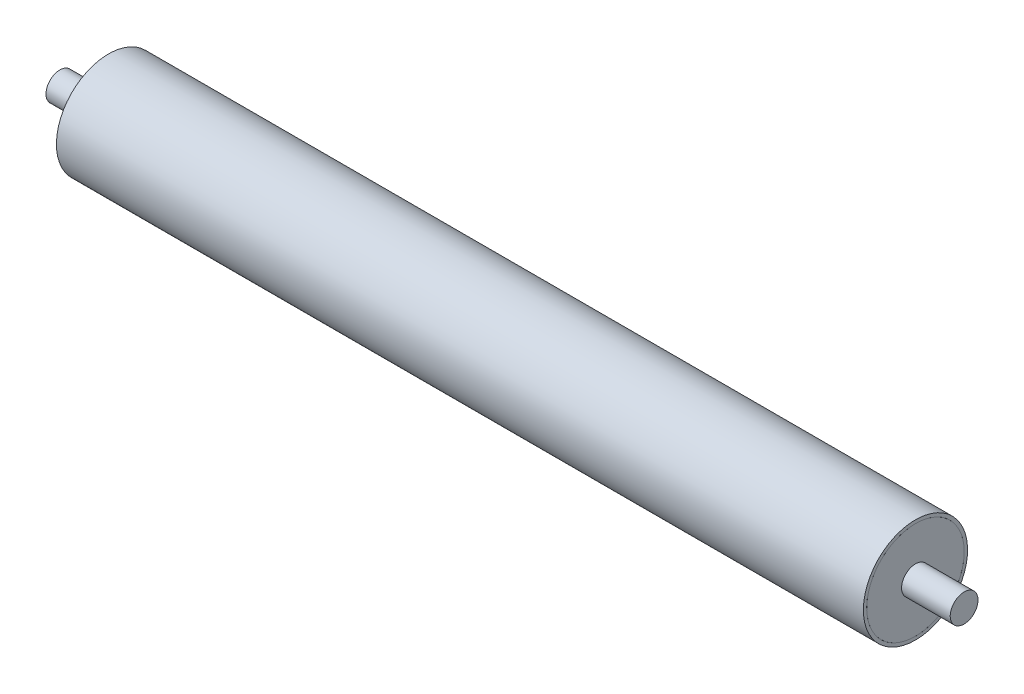
ISO-10303-21;
HEADER;
FILE_DESCRIPTION(('STEP AP214'),'2;1');
FILE_NAME('part.step','',(''),(''),'','','');
FILE_SCHEMA(('AUTOMOTIVE_DESIGN { 1 0 10303 214 1 1 1 1 }'));
ENDSEC;
DATA;
#1=APPLICATION_CONTEXT('core data for automotive mechanical design processes');
#2=APPLICATION_PROTOCOL_DEFINITION('international standard','automotive_design',2000,#1);
#3=PRODUCT_CONTEXT('',#1,'mechanical');
#4=PRODUCT('Part','Part','',(#3));
#5=PRODUCT_RELATED_PRODUCT_CATEGORY('part','',(#4));
#6=PRODUCT_DEFINITION_FORMATION('','',#4);
#7=PRODUCT_DEFINITION_CONTEXT('part definition',#1,'design');
#8=PRODUCT_DEFINITION('design','',#6,#7);
#9=PRODUCT_DEFINITION_SHAPE('','',#8);
#10=(LENGTH_UNIT() NAMED_UNIT(*) SI_UNIT(.MILLI.,.METRE.));
#11=(NAMED_UNIT(*) PLANE_ANGLE_UNIT() SI_UNIT($,.RADIAN.));
#12=(NAMED_UNIT(*) SI_UNIT($,.STERADIAN.) SOLID_ANGLE_UNIT());
#13=UNCERTAINTY_MEASURE_WITH_UNIT(LENGTH_MEASURE(1.E-05),#10,'distance_accuracy_value','');
#14=(GEOMETRIC_REPRESENTATION_CONTEXT(3) GLOBAL_UNCERTAINTY_ASSIGNED_CONTEXT((#13)) GLOBAL_UNIT_ASSIGNED_CONTEXT((#10,
#11,#12)) REPRESENTATION_CONTEXT('',''));
#15=CARTESIAN_POINT('',(0.,0.,0.));
#16=DIRECTION('',(0.,0.,1.));
#17=DIRECTION('',(1.,0.,0.));
#18=AXIS2_PLACEMENT_3D('',#15,#16,#17);
#19=CARTESIAN_POINT('',(-325.3,9.99999999999994,0.));
#20=DIRECTION('',(1.,0.,0.));
#21=DIRECTION('',(0.,1.,0.));
#22=AXIS2_PLACEMENT_3D('',#19,#20,#21);
#23=PLANE('',#22);
#24=CARTESIAN_POINT('',(-325.3,0.,0.));
#25=DIRECTION('',(-1.,0.,0.));
#26=DIRECTION('',(0.,-1.,0.));
#27=AXIS2_PLACEMENT_3D('',#24,#25,#26);
#28=CIRCLE('',#27,10.);
#29=CARTESIAN_POINT('',(-325.3,-10.0000000000001,0.));
#30=VERTEX_POINT('',#29);
#31=EDGE_CURVE('E47',#30,#30,#28,.T.);
#32=ORIENTED_EDGE('',*,*,#31,.T.);
#33=EDGE_LOOP('',(#32));
#34=FACE_BOUND('',#33,.T.);
#35=ADVANCED_FACE('F41',(#34),#23,.F.);
#36=CARTESIAN_POINT('',(325.3,10.0000000000002,0.));
#37=DIRECTION('',(-1.,0.,0.));
#38=DIRECTION('',(0.,-1.,0.));
#39=AXIS2_PLACEMENT_3D('',#36,#37,#38);
#40=PLANE('',#39);
#41=CARTESIAN_POINT('',(325.3,0.,0.));
#42=DIRECTION('',(-1.,0.,0.));
#43=DIRECTION('',(0.,-1.,0.));
#44=AXIS2_PLACEMENT_3D('',#41,#42,#43);
#45=CIRCLE('',#44,10.0000000000001);
#46=CARTESIAN_POINT('',(325.3,-10.,0.));
#47=VERTEX_POINT('',#46);
#48=EDGE_CURVE('E11',#47,#47,#45,.T.);
#49=ORIENTED_EDGE('',*,*,#48,.F.);
#50=EDGE_LOOP('',(#49));
#51=FACE_BOUND('',#50,.T.);
#52=ADVANCED_FACE('F56',(#51),#40,.F.);
#53=CARTESIAN_POINT('',(-325.3,0.,0.));
#54=DIRECTION('',(-1.,0.,0.));
#55=DIRECTION('',(0.,-1.,0.));
#56=AXIS2_PLACEMENT_3D('',#53,#54,#55);
#57=CYLINDRICAL_SURFACE('',#56,10.0000000000001);
#58=ORIENTED_EDGE('',*,*,#31,.F.);
#59=EDGE_LOOP('',(#58));
#60=FACE_BOUND('',#59,.T.);
#61=ORIENTED_EDGE('',*,*,#48,.T.);
#62=EDGE_LOOP('',(#61));
#63=FACE_BOUND('',#62,.T.);
#64=ADVANCED_FACE('F54',(#60,#63),#57,.T.);
#65=CLOSED_SHELL('',(#35,#52,#64));
#66=MANIFOLD_SOLID_BREP('B2',#65);
#67=CARTESIAN_POINT('',(280.3,0.,0.));
#68=DIRECTION('',(1.,0.,0.));
#69=DIRECTION('',(0.,1.,0.));
#70=AXIS2_PLACEMENT_3D('',#67,#68,#69);
#71=CYLINDRICAL_SURFACE('',#70,35.1);
#72=CARTESIAN_POINT('',(280.3,0.,0.));
#73=DIRECTION('',(1.,0.,0.));
#74=DIRECTION('',(0.,1.,0.));
#75=AXIS2_PLACEMENT_3D('',#72,#73,#74);
#76=CIRCLE('',#75,35.1);
#77=CARTESIAN_POINT('',(280.3,35.1000000000001,0.));
#78=VERTEX_POINT('',#77);
#79=EDGE_CURVE('E40',#78,#78,#76,.T.);
#80=ORIENTED_EDGE('',*,*,#79,.T.);
#81=EDGE_LOOP('',(#80));
#82=FACE_BOUND('',#81,.T.);
#83=CARTESIAN_POINT('',(290.3,0.,0.));
#84=DIRECTION('',(1.,0.,0.));
#85=DIRECTION('',(0.,1.,0.));
#86=AXIS2_PLACEMENT_3D('',#83,#84,#85);
#87=CIRCLE('',#86,35.1);
#88=CARTESIAN_POINT('',(290.3,35.1000000000001,0.));
#89=VERTEX_POINT('',#88);
#90=EDGE_CURVE('E92',#89,#89,#87,.T.);
#91=ORIENTED_EDGE('',*,*,#90,.F.);
#92=EDGE_LOOP('',(#91));
#93=FACE_BOUND('',#92,.T.);
#94=ADVANCED_FACE('F89',(#82,#93),#71,.T.);
#95=CARTESIAN_POINT('',(280.3,0.,0.));
#96=DIRECTION('',(1.,0.,0.));
#97=DIRECTION('',(0.,1.,0.));
#98=AXIS2_PLACEMENT_3D('',#95,#96,#97);
#99=PLANE('',#98);
#100=CARTESIAN_POINT('',(280.3,0.,0.));
#101=DIRECTION('',(1.,0.,0.));
#102=DIRECTION('',(0.,1.,0.));
#103=AXIS2_PLACEMENT_3D('',#100,#101,#102);
#104=CIRCLE('',#103,10.0005);
#105=CARTESIAN_POINT('',(280.3,10.0005000000001,0.));
#106=VERTEX_POINT('',#105);
#107=EDGE_CURVE('E99',#106,#106,#104,.T.);
#108=ORIENTED_EDGE('',*,*,#107,.T.);
#109=EDGE_LOOP('',(#108));
#110=FACE_BOUND('',#109,.T.);
#111=ORIENTED_EDGE('',*,*,#79,.F.);
#112=EDGE_LOOP('',(#111));
#113=FACE_BOUND('',#112,.T.);
#114=ADVANCED_FACE('F107',(#110,#113),#99,.F.);
#115=CARTESIAN_POINT('',(290.3,0.,0.));
#116=DIRECTION('',(1.,0.,0.));
#117=DIRECTION('',(0.,1.,0.));
#118=AXIS2_PLACEMENT_3D('',#115,#116,#117);
#119=PLANE('',#118);
#120=CARTESIAN_POINT('',(290.3,0.,0.));
#121=DIRECTION('',(1.,0.,0.));
#122=DIRECTION('',(0.,1.,0.));
#123=AXIS2_PLACEMENT_3D('',#120,#121,#122);
#124=CIRCLE('',#123,10.0005);
#125=CARTESIAN_POINT('',(290.3,10.0005000000001,0.));
#126=VERTEX_POINT('',#125);
#127=EDGE_CURVE('E101',#126,#126,#124,.T.);
#128=ORIENTED_EDGE('',*,*,#127,.F.);
#129=EDGE_LOOP('',(#128));
#130=FACE_BOUND('',#129,.T.);
#131=ORIENTED_EDGE('',*,*,#90,.T.);
#132=EDGE_LOOP('',(#131));
#133=FACE_BOUND('',#132,.T.);
#134=ADVANCED_FACE('F113',(#130,#133),#119,.T.);
#135=CARTESIAN_POINT('',(280.3,0.,0.));
#136=DIRECTION('',(1.,0.,0.));
#137=DIRECTION('',(0.,1.,0.));
#138=AXIS2_PLACEMENT_3D('',#135,#136,#137);
#139=CYLINDRICAL_SURFACE('',#138,10.0005);
#140=ORIENTED_EDGE('',*,*,#107,.F.);
#141=EDGE_LOOP('',(#140));
#142=FACE_BOUND('',#141,.T.);
#143=ORIENTED_EDGE('',*,*,#127,.T.);
#144=EDGE_LOOP('',(#143));
#145=FACE_BOUND('',#144,.T.);
#146=ADVANCED_FACE('F110',(#142,#145),#139,.F.);
#147=CLOSED_SHELL('',(#94,#114,#134,#146));
#148=MANIFOLD_SOLID_BREP('B6',#147);
#149=CARTESIAN_POINT('',(-280.3,0.,0.));
#150=DIRECTION('',(-1.,0.,0.));
#151=DIRECTION('',(0.,-1.,0.));
#152=AXIS2_PLACEMENT_3D('',#149,#150,#151);
#153=CYLINDRICAL_SURFACE('',#152,35.1);
#154=CARTESIAN_POINT('',(-280.3,0.,0.));
#155=DIRECTION('',(-1.,0.,0.));
#156=DIRECTION('',(0.,-1.,0.));
#157=AXIS2_PLACEMENT_3D('',#154,#155,#156);
#158=CIRCLE('',#157,35.1);
#159=CARTESIAN_POINT('',(-280.3,-35.1,0.));
#160=VERTEX_POINT('',#159);
#161=EDGE_CURVE('E88',#160,#160,#158,.T.);
#162=ORIENTED_EDGE('',*,*,#161,.T.);
#163=EDGE_LOOP('',(#162));
#164=FACE_BOUND('',#163,.T.);
#165=CARTESIAN_POINT('',(-290.3,0.,0.));
#166=DIRECTION('',(-1.,0.,0.));
#167=DIRECTION('',(0.,-1.,0.));
#168=AXIS2_PLACEMENT_3D('',#165,#166,#167);
#169=CIRCLE('',#168,35.1);
#170=CARTESIAN_POINT('',(-290.3,-35.1,0.));
#171=VERTEX_POINT('',#170);
#172=EDGE_CURVE('E160',#171,#171,#169,.T.);
#173=ORIENTED_EDGE('',*,*,#172,.F.);
#174=EDGE_LOOP('',(#173));
#175=FACE_BOUND('',#174,.T.);
#176=ADVANCED_FACE('F157',(#164,#175),#153,.T.);
#177=CARTESIAN_POINT('',(-280.3,0.,0.));
#178=DIRECTION('',(-1.,0.,0.));
#179=DIRECTION('',(0.,-1.,0.));
#180=AXIS2_PLACEMENT_3D('',#177,#178,#179);
#181=PLANE('',#180);
#182=CARTESIAN_POINT('',(-280.3,0.,0.));
#183=DIRECTION('',(-1.,0.,0.));
#184=DIRECTION('',(0.,-1.,0.));
#185=AXIS2_PLACEMENT_3D('',#182,#183,#184);
#186=CIRCLE('',#185,10.0005);
#187=CARTESIAN_POINT('',(-280.3,-10.0005,0.));
#188=VERTEX_POINT('',#187);
#189=EDGE_CURVE('E167',#188,#188,#186,.T.);
#190=ORIENTED_EDGE('',*,*,#189,.T.);
#191=EDGE_LOOP('',(#190));
#192=FACE_BOUND('',#191,.T.);
#193=ORIENTED_EDGE('',*,*,#161,.F.);
#194=EDGE_LOOP('',(#193));
#195=FACE_BOUND('',#194,.T.);
#196=ADVANCED_FACE('F175',(#192,#195),#181,.F.);
#197=CARTESIAN_POINT('',(-290.3,0.,0.));
#198=DIRECTION('',(-1.,0.,0.));
#199=DIRECTION('',(0.,-1.,0.));
#200=AXIS2_PLACEMENT_3D('',#197,#198,#199);
#201=PLANE('',#200);
#202=CARTESIAN_POINT('',(-290.3,0.,0.));
#203=DIRECTION('',(-1.,0.,0.));
#204=DIRECTION('',(0.,-1.,0.));
#205=AXIS2_PLACEMENT_3D('',#202,#203,#204);
#206=CIRCLE('',#205,10.0005);
#207=CARTESIAN_POINT('',(-290.3,-10.0005,0.));
#208=VERTEX_POINT('',#207);
#209=EDGE_CURVE('E169',#208,#208,#206,.T.);
#210=ORIENTED_EDGE('',*,*,#209,.F.);
#211=EDGE_LOOP('',(#210));
#212=FACE_BOUND('',#211,.T.);
#213=ORIENTED_EDGE('',*,*,#172,.T.);
#214=EDGE_LOOP('',(#213));
#215=FACE_BOUND('',#214,.T.);
#216=ADVANCED_FACE('F181',(#212,#215),#201,.T.);
#217=CARTESIAN_POINT('',(-280.3,0.,0.));
#218=DIRECTION('',(-1.,0.,0.));
#219=DIRECTION('',(0.,-1.,0.));
#220=AXIS2_PLACEMENT_3D('',#217,#218,#219);
#221=CYLINDRICAL_SURFACE('',#220,10.0005);
#222=ORIENTED_EDGE('',*,*,#189,.F.);
#223=EDGE_LOOP('',(#222));
#224=FACE_BOUND('',#223,.T.);
#225=ORIENTED_EDGE('',*,*,#209,.T.);
#226=EDGE_LOOP('',(#225));
#227=FACE_BOUND('',#226,.T.);
#228=ADVANCED_FACE('F178',(#224,#227),#221,.F.);
#229=CLOSED_SHELL('',(#176,#196,#216,#228));
#230=MANIFOLD_SOLID_BREP('B35',#229);
#231=CARTESIAN_POINT('',(-290.3,35.1004999999999,0.));
#232=DIRECTION('',(1.,0.,0.));
#233=DIRECTION('',(0.,1.,0.));
#234=AXIS2_PLACEMENT_3D('',#231,#232,#233);
#235=PLANE('',#234);
#236=CARTESIAN_POINT('',(-290.3,0.,0.));
#237=DIRECTION('',(-1.,0.,0.));
#238=DIRECTION('',(0.,-1.,0.));
#239=AXIS2_PLACEMENT_3D('',#236,#237,#238);
#240=CIRCLE('',#239,35.1004999999999);
#241=CARTESIAN_POINT('',(-290.3,-35.1004999999999,0.));
#242=VERTEX_POINT('',#241);
#243=EDGE_CURVE('E232',#242,#242,#240,.T.);
#244=ORIENTED_EDGE('',*,*,#243,.F.);
#245=EDGE_LOOP('',(#244));
#246=FACE_BOUND('',#245,.T.);
#247=CARTESIAN_POINT('',(-290.3,0.,0.));
#248=DIRECTION('',(-1.,0.,0.));
#249=DIRECTION('',(0.,-1.,0.));
#250=AXIS2_PLACEMENT_3D('',#247,#248,#249);
#251=CIRCLE('',#250,37.5);
#252=CARTESIAN_POINT('',(-290.3,-37.5,0.));
#253=VERTEX_POINT('',#252);
#254=EDGE_CURVE('E156',#253,#253,#251,.T.);
#255=ORIENTED_EDGE('',*,*,#254,.T.);
#256=EDGE_LOOP('',(#255));
#257=FACE_BOUND('',#256,.T.);
#258=ADVANCED_FACE('F218',(#246,#257),#235,.F.);
#259=CARTESIAN_POINT('',(-290.3,0.,0.));
#260=DIRECTION('',(-1.,0.,0.));
#261=DIRECTION('',(0.,-1.,0.));
#262=AXIS2_PLACEMENT_3D('',#259,#260,#261);
#263=CYLINDRICAL_SURFACE('',#262,37.5);
#264=ORIENTED_EDGE('',*,*,#254,.F.);
#265=EDGE_LOOP('',(#264));
#266=FACE_BOUND('',#265,.T.);
#267=CARTESIAN_POINT('',(290.3,1.06654489737743E-13,0.));
#268=DIRECTION('',(-1.,0.,0.));
#269=DIRECTION('',(0.,-1.,0.));
#270=AXIS2_PLACEMENT_3D('',#267,#268,#269);
#271=CIRCLE('',#270,37.5);
#272=CARTESIAN_POINT('',(290.3,-37.4999999999999,0.));
#273=VERTEX_POINT('',#272);
#274=EDGE_CURVE('E224',#273,#273,#271,.T.);
#275=ORIENTED_EDGE('',*,*,#274,.T.);
#276=EDGE_LOOP('',(#275));
#277=FACE_BOUND('',#276,.T.);
#278=ADVANCED_FACE('F241',(#266,#277),#263,.T.);
#279=CARTESIAN_POINT('',(290.3,37.5000000000001,0.));
#280=DIRECTION('',(-1.,0.,0.));
#281=DIRECTION('',(0.,-1.,0.));
#282=AXIS2_PLACEMENT_3D('',#279,#280,#281);
#283=PLANE('',#282);
#284=ORIENTED_EDGE('',*,*,#274,.F.);
#285=EDGE_LOOP('',(#284));
#286=FACE_BOUND('',#285,.T.);
#287=CARTESIAN_POINT('',(290.3,1.06654489737743E-13,0.));
#288=DIRECTION('',(-1.,0.,0.));
#289=DIRECTION('',(0.,-1.,0.));
#290=AXIS2_PLACEMENT_3D('',#287,#288,#289);
#291=CIRCLE('',#290,35.1004999999999);
#292=CARTESIAN_POINT('',(290.3,-35.1004999999998,0.));
#293=VERTEX_POINT('',#292);
#294=EDGE_CURVE('E228',#293,#293,#291,.T.);
#295=ORIENTED_EDGE('',*,*,#294,.T.);
#296=EDGE_LOOP('',(#295));
#297=FACE_BOUND('',#296,.T.);
#298=ADVANCED_FACE('F245',(#286,#297),#283,.F.);
#299=CARTESIAN_POINT('',(-290.3,0.,0.));
#300=DIRECTION('',(-1.,0.,0.));
#301=DIRECTION('',(0.,-1.,0.));
#302=AXIS2_PLACEMENT_3D('',#299,#300,#301);
#303=CYLINDRICAL_SURFACE('',#302,35.1004999999999);
#304=ORIENTED_EDGE('',*,*,#294,.F.);
#305=EDGE_LOOP('',(#304));
#306=FACE_BOUND('',#305,.T.);
#307=ORIENTED_EDGE('',*,*,#243,.T.);
#308=EDGE_LOOP('',(#307));
#309=FACE_BOUND('',#308,.T.);
#310=ADVANCED_FACE('F238',(#306,#309),#303,.F.);
#311=CLOSED_SHELL('',(#258,#278,#298,#310));
#312=MANIFOLD_SOLID_BREP('B83',#311);
#313=ADVANCED_BREP_SHAPE_REPRESENTATION('',(#18,#66,#148,#230,#312),#14);
#314=SHAPE_DEFINITION_REPRESENTATION(#9,#313);
ENDSEC;
END-ISO-10303-21;
